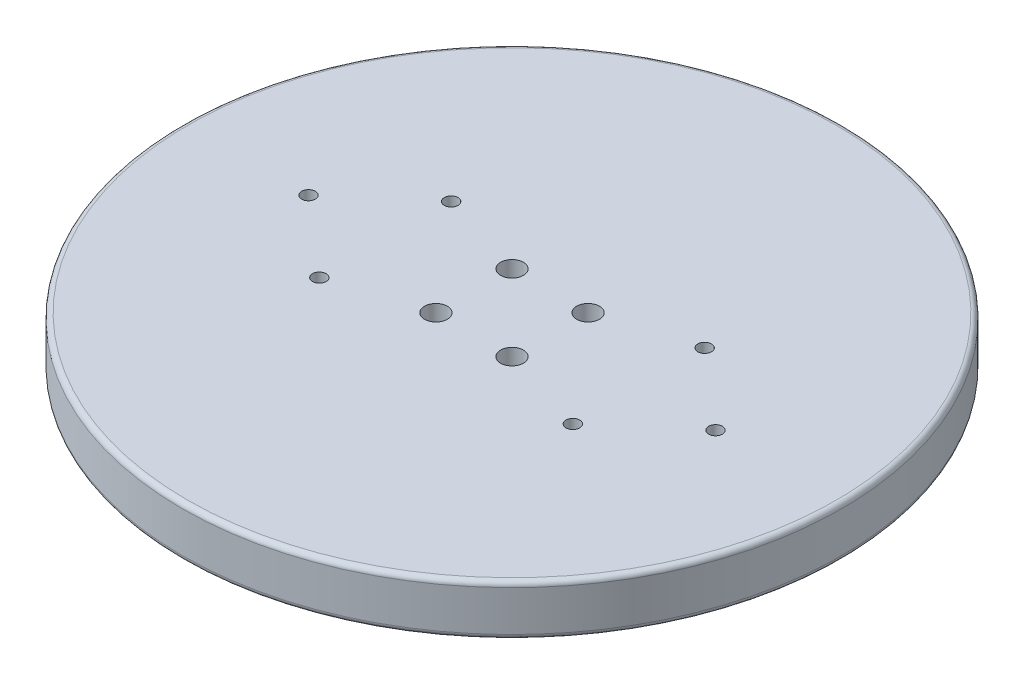
ISO-10303-21;
HEADER;
FILE_DESCRIPTION(('STEP AP214'),'2;1');
FILE_NAME('part.step','',(''),(''),'','','');
FILE_SCHEMA(('AUTOMOTIVE_DESIGN { 1 0 10303 214 1 1 1 1 }'));
ENDSEC;
DATA;
#1=APPLICATION_CONTEXT('core data for automotive mechanical design processes');
#2=APPLICATION_PROTOCOL_DEFINITION('international standard','automotive_design',2000,#1);
#3=PRODUCT_CONTEXT('',#1,'mechanical');
#4=PRODUCT('Part','Part','',(#3));
#5=PRODUCT_RELATED_PRODUCT_CATEGORY('part','',(#4));
#6=PRODUCT_DEFINITION_FORMATION('','',#4);
#7=PRODUCT_DEFINITION_CONTEXT('part definition',#1,'design');
#8=PRODUCT_DEFINITION('design','',#6,#7);
#9=PRODUCT_DEFINITION_SHAPE('','',#8);
#10=(LENGTH_UNIT() NAMED_UNIT(*) SI_UNIT(.MILLI.,.METRE.));
#11=(NAMED_UNIT(*) PLANE_ANGLE_UNIT() SI_UNIT($,.RADIAN.));
#12=(NAMED_UNIT(*) SI_UNIT($,.STERADIAN.) SOLID_ANGLE_UNIT());
#13=UNCERTAINTY_MEASURE_WITH_UNIT(LENGTH_MEASURE(1.E-05),#10,'distance_accuracy_value','');
#14=(GEOMETRIC_REPRESENTATION_CONTEXT(3) GLOBAL_UNCERTAINTY_ASSIGNED_CONTEXT((#13)) GLOBAL_UNIT_ASSIGNED_CONTEXT((#10,
#11,#12)) REPRESENTATION_CONTEXT('',''));
#15=CARTESIAN_POINT('',(0.,0.,0.));
#16=DIRECTION('',(0.,0.,1.));
#17=DIRECTION('',(1.,0.,0.));
#18=AXIS2_PLACEMENT_3D('',#15,#16,#17);
#19=CARTESIAN_POINT('',(0.,10.,0.));
#20=DIRECTION('',(0.,1.,0.));
#21=DIRECTION('',(0.,0.,1.));
#22=AXIS2_PLACEMENT_3D('',#19,#20,#21);
#23=PLANE('',#22);
#24=CARTESIAN_POINT('',(0.,10.,0.));
#25=DIRECTION('',(0.,1.,0.));
#26=DIRECTION('',(0.,0.,1.));
#27=AXIS2_PLACEMENT_3D('',#24,#25,#26);
#28=CIRCLE('',#27,64.);
#29=CARTESIAN_POINT('',(0.,10.,64.));
#30=VERTEX_POINT('',#29);
#31=EDGE_CURVE('E10',#30,#30,#28,.T.);
#32=ORIENTED_EDGE('',*,*,#31,.T.);
#33=EDGE_LOOP('',(#32));
#34=FACE_BOUND('',#33,.T.);
#35=CARTESIAN_POINT('',(25.,10.,-13.));
#36=DIRECTION('',(0.,-1.,0.));
#37=DIRECTION('',(0.,0.,-1.));
#38=AXIS2_PLACEMENT_3D('',#35,#36,#37);
#39=CIRCLE('',#38,1.35255);
#40=CARTESIAN_POINT('',(25.,10.,-14.35255));
#41=VERTEX_POINT('',#40);
#42=EDGE_CURVE('E53',#41,#41,#39,.T.);
#43=ORIENTED_EDGE('',*,*,#42,.T.);
#44=EDGE_LOOP('',(#43));
#45=FACE_BOUND('',#44,.T.);
#46=CARTESIAN_POINT('',(25.,10.,13.));
#47=DIRECTION('',(0.,-1.,0.));
#48=DIRECTION('',(0.,0.,-1.));
#49=AXIS2_PLACEMENT_3D('',#46,#47,#48);
#50=CIRCLE('',#49,1.35255);
#51=CARTESIAN_POINT('',(25.,10.,11.64745));
#52=VERTEX_POINT('',#51);
#53=EDGE_CURVE('E59',#52,#52,#50,.T.);
#54=ORIENTED_EDGE('',*,*,#53,.T.);
#55=EDGE_LOOP('',(#54));
#56=FACE_BOUND('',#55,.T.);
#57=CARTESIAN_POINT('',(-25.,10.,13.));
#58=DIRECTION('',(0.,-1.,0.));
#59=DIRECTION('',(0.,0.,-1.));
#60=AXIS2_PLACEMENT_3D('',#57,#58,#59);
#61=CIRCLE('',#60,1.35255);
#62=CARTESIAN_POINT('',(-25.,10.,11.64745));
#63=VERTEX_POINT('',#62);
#64=EDGE_CURVE('E65',#63,#63,#61,.T.);
#65=ORIENTED_EDGE('',*,*,#64,.T.);
#66=EDGE_LOOP('',(#65));
#67=FACE_BOUND('',#66,.T.);
#68=CARTESIAN_POINT('',(-25.,10.,-13.));
#69=DIRECTION('',(0.,-1.,0.));
#70=DIRECTION('',(0.,0.,-1.));
#71=AXIS2_PLACEMENT_3D('',#68,#69,#70);
#72=CIRCLE('',#71,1.35255);
#73=CARTESIAN_POINT('',(-25.,10.,-14.35255));
#74=VERTEX_POINT('',#73);
#75=EDGE_CURVE('E71',#74,#74,#72,.T.);
#76=ORIENTED_EDGE('',*,*,#75,.T.);
#77=EDGE_LOOP('',(#76));
#78=FACE_BOUND('',#77,.T.);
#79=CARTESIAN_POINT('',(40.14,10.,0.));
#80=DIRECTION('',(0.,-1.,0.));
#81=DIRECTION('',(0.,0.,-1.));
#82=AXIS2_PLACEMENT_3D('',#79,#80,#81);
#83=CIRCLE('',#82,1.35254999999999);
#84=CARTESIAN_POINT('',(40.14,10.,-1.35254999999999));
#85=VERTEX_POINT('',#84);
#86=EDGE_CURVE('E77',#85,#85,#83,.T.);
#87=ORIENTED_EDGE('',*,*,#86,.T.);
#88=EDGE_LOOP('',(#87));
#89=FACE_BOUND('',#88,.T.);
#90=CARTESIAN_POINT('',(-40.14,10.,0.));
#91=DIRECTION('',(0.,-1.,0.));
#92=DIRECTION('',(0.,0.,-1.));
#93=AXIS2_PLACEMENT_3D('',#90,#91,#92);
#94=CIRCLE('',#93,1.35254999999999);
#95=CARTESIAN_POINT('',(-40.14,10.,-1.35254999999999));
#96=VERTEX_POINT('',#95);
#97=EDGE_CURVE('E83',#96,#96,#94,.T.);
#98=ORIENTED_EDGE('',*,*,#97,.T.);
#99=EDGE_LOOP('',(#98));
#100=FACE_BOUND('',#99,.T.);
#101=CARTESIAN_POINT('',(7.5,10.,-7.5));
#102=DIRECTION('',(0.,-1.,0.));
#103=DIRECTION('',(0.,0.,-1.));
#104=AXIS2_PLACEMENT_3D('',#101,#102,#103);
#105=CIRCLE('',#104,2.2479);
#106=CARTESIAN_POINT('',(7.5,10.,-9.7479));
#107=VERTEX_POINT('',#106);
#108=EDGE_CURVE('E89',#107,#107,#105,.T.);
#109=ORIENTED_EDGE('',*,*,#108,.T.);
#110=EDGE_LOOP('',(#109));
#111=FACE_BOUND('',#110,.T.);
#112=CARTESIAN_POINT('',(-7.5,10.,-7.5));
#113=DIRECTION('',(0.,-1.,0.));
#114=DIRECTION('',(0.,0.,-1.));
#115=AXIS2_PLACEMENT_3D('',#112,#113,#114);
#116=CIRCLE('',#115,2.2479);
#117=CARTESIAN_POINT('',(-7.5,10.,-9.7479));
#118=VERTEX_POINT('',#117);
#119=EDGE_CURVE('E95',#118,#118,#116,.T.);
#120=ORIENTED_EDGE('',*,*,#119,.T.);
#121=EDGE_LOOP('',(#120));
#122=FACE_BOUND('',#121,.T.);
#123=CARTESIAN_POINT('',(7.5,10.,7.5));
#124=DIRECTION('',(0.,-1.,0.));
#125=DIRECTION('',(0.,0.,-1.));
#126=AXIS2_PLACEMENT_3D('',#123,#124,#125);
#127=CIRCLE('',#126,2.2479);
#128=CARTESIAN_POINT('',(7.5,10.,5.2521));
#129=VERTEX_POINT('',#128);
#130=EDGE_CURVE('E101',#129,#129,#127,.T.);
#131=ORIENTED_EDGE('',*,*,#130,.T.);
#132=EDGE_LOOP('',(#131));
#133=FACE_BOUND('',#132,.T.);
#134=CARTESIAN_POINT('',(-7.5,10.,7.5));
#135=DIRECTION('',(0.,-1.,0.));
#136=DIRECTION('',(0.,0.,-1.));
#137=AXIS2_PLACEMENT_3D('',#134,#135,#136);
#138=CIRCLE('',#137,2.2479);
#139=CARTESIAN_POINT('',(-7.5,10.,5.2521));
#140=VERTEX_POINT('',#139);
#141=EDGE_CURVE('E107',#140,#140,#138,.T.);
#142=ORIENTED_EDGE('',*,*,#141,.T.);
#143=EDGE_LOOP('',(#142));
#144=FACE_BOUND('',#143,.T.);
#145=ADVANCED_FACE('F33',(#34,#45,#56,#67,#78,#89,#100,#111,#122,#133,#144),#23,.T.);
#146=CARTESIAN_POINT('',(0.,0.,0.));
#147=DIRECTION('',(0.,1.,0.));
#148=DIRECTION('',(0.,0.,1.));
#149=AXIS2_PLACEMENT_3D('',#146,#147,#148);
#150=PLANE('',#149);
#151=CARTESIAN_POINT('',(-7.5,0.,7.5));
#152=DIRECTION('',(0.,-1.,0.));
#153=DIRECTION('',(0.,0.,-1.));
#154=AXIS2_PLACEMENT_3D('',#151,#152,#153);
#155=CIRCLE('',#154,2.2479);
#156=CARTESIAN_POINT('',(-7.5,0.,5.2521));
#157=VERTEX_POINT('',#156);
#158=EDGE_CURVE('E110',#157,#157,#155,.T.);
#159=ORIENTED_EDGE('',*,*,#158,.F.);
#160=EDGE_LOOP('',(#159));
#161=FACE_BOUND('',#160,.T.);
#162=CARTESIAN_POINT('',(-7.5,0.,-7.5));
#163=DIRECTION('',(0.,-1.,0.));
#164=DIRECTION('',(0.,0.,-1.));
#165=AXIS2_PLACEMENT_3D('',#162,#163,#164);
#166=CIRCLE('',#165,2.2479);
#167=CARTESIAN_POINT('',(-7.5,0.,-9.7479));
#168=VERTEX_POINT('',#167);
#169=EDGE_CURVE('E98',#168,#168,#166,.T.);
#170=ORIENTED_EDGE('',*,*,#169,.F.);
#171=EDGE_LOOP('',(#170));
#172=FACE_BOUND('',#171,.T.);
#173=CARTESIAN_POINT('',(7.5,0.,-7.5));
#174=DIRECTION('',(0.,-1.,0.));
#175=DIRECTION('',(0.,0.,-1.));
#176=AXIS2_PLACEMENT_3D('',#173,#174,#175);
#177=CIRCLE('',#176,2.2479);
#178=CARTESIAN_POINT('',(7.5,0.,-9.7479));
#179=VERTEX_POINT('',#178);
#180=EDGE_CURVE('E92',#179,#179,#177,.T.);
#181=ORIENTED_EDGE('',*,*,#180,.F.);
#182=EDGE_LOOP('',(#181));
#183=FACE_BOUND('',#182,.T.);
#184=CARTESIAN_POINT('',(-40.14,0.,0.));
#185=DIRECTION('',(0.,-1.,0.));
#186=DIRECTION('',(0.,0.,-1.));
#187=AXIS2_PLACEMENT_3D('',#184,#185,#186);
#188=CIRCLE('',#187,1.35255);
#189=CARTESIAN_POINT('',(-40.14,0.,-1.35255));
#190=VERTEX_POINT('',#189);
#191=EDGE_CURVE('E86',#190,#190,#188,.T.);
#192=ORIENTED_EDGE('',*,*,#191,.F.);
#193=EDGE_LOOP('',(#192));
#194=FACE_BOUND('',#193,.T.);
#195=CARTESIAN_POINT('',(40.14,0.,0.));
#196=DIRECTION('',(0.,-1.,0.));
#197=DIRECTION('',(0.,0.,-1.));
#198=AXIS2_PLACEMENT_3D('',#195,#196,#197);
#199=CIRCLE('',#198,1.35255);
#200=CARTESIAN_POINT('',(40.14,0.,-1.35255));
#201=VERTEX_POINT('',#200);
#202=EDGE_CURVE('E80',#201,#201,#199,.T.);
#203=ORIENTED_EDGE('',*,*,#202,.F.);
#204=EDGE_LOOP('',(#203));
#205=FACE_BOUND('',#204,.T.);
#206=CARTESIAN_POINT('',(-25.,0.,-13.));
#207=DIRECTION('',(0.,-1.,0.));
#208=DIRECTION('',(0.,0.,-1.));
#209=AXIS2_PLACEMENT_3D('',#206,#207,#208);
#210=CIRCLE('',#209,1.35255);
#211=CARTESIAN_POINT('',(-25.,0.,-14.35255));
#212=VERTEX_POINT('',#211);
#213=EDGE_CURVE('E74',#212,#212,#210,.T.);
#214=ORIENTED_EDGE('',*,*,#213,.F.);
#215=EDGE_LOOP('',(#214));
#216=FACE_BOUND('',#215,.T.);
#217=CARTESIAN_POINT('',(-25.,0.,13.));
#218=DIRECTION('',(0.,-1.,0.));
#219=DIRECTION('',(0.,0.,-1.));
#220=AXIS2_PLACEMENT_3D('',#217,#218,#219);
#221=CIRCLE('',#220,1.35255);
#222=CARTESIAN_POINT('',(-25.,0.,11.64745));
#223=VERTEX_POINT('',#222);
#224=EDGE_CURVE('E68',#223,#223,#221,.T.);
#225=ORIENTED_EDGE('',*,*,#224,.F.);
#226=EDGE_LOOP('',(#225));
#227=FACE_BOUND('',#226,.T.);
#228=CARTESIAN_POINT('',(25.,0.,13.));
#229=DIRECTION('',(0.,-1.,0.));
#230=DIRECTION('',(0.,0.,-1.));
#231=AXIS2_PLACEMENT_3D('',#228,#229,#230);
#232=CIRCLE('',#231,1.35255);
#233=CARTESIAN_POINT('',(25.,0.,11.64745));
#234=VERTEX_POINT('',#233);
#235=EDGE_CURVE('E62',#234,#234,#232,.T.);
#236=ORIENTED_EDGE('',*,*,#235,.F.);
#237=EDGE_LOOP('',(#236));
#238=FACE_BOUND('',#237,.T.);
#239=CARTESIAN_POINT('',(25.,0.,-13.));
#240=DIRECTION('',(0.,-1.,0.));
#241=DIRECTION('',(0.,0.,-1.));
#242=AXIS2_PLACEMENT_3D('',#239,#240,#241);
#243=CIRCLE('',#242,1.35255);
#244=CARTESIAN_POINT('',(25.,0.,-14.35255));
#245=VERTEX_POINT('',#244);
#246=EDGE_CURVE('E56',#245,#245,#243,.T.);
#247=ORIENTED_EDGE('',*,*,#246,.F.);
#248=EDGE_LOOP('',(#247));
#249=FACE_BOUND('',#248,.T.);
#250=CARTESIAN_POINT('',(0.,0.,0.));
#251=DIRECTION('',(0.,1.,0.));
#252=DIRECTION('',(0.,0.,1.));
#253=AXIS2_PLACEMENT_3D('',#250,#251,#252);
#254=CIRCLE('',#253,64.);
#255=CARTESIAN_POINT('',(0.,0.,64.));
#256=VERTEX_POINT('',#255);
#257=EDGE_CURVE('E40',#256,#256,#254,.F.);
#258=ORIENTED_EDGE('',*,*,#257,.T.);
#259=EDGE_LOOP('',(#258));
#260=FACE_BOUND('',#259,.T.);
#261=CARTESIAN_POINT('',(7.5,0.,7.5));
#262=DIRECTION('',(0.,-1.,0.));
#263=DIRECTION('',(0.,0.,-1.));
#264=AXIS2_PLACEMENT_3D('',#261,#262,#263);
#265=CIRCLE('',#264,2.2479);
#266=CARTESIAN_POINT('',(7.5,0.,5.2521));
#267=VERTEX_POINT('',#266);
#268=EDGE_CURVE('E104',#267,#267,#265,.T.);
#269=ORIENTED_EDGE('',*,*,#268,.F.);
#270=EDGE_LOOP('',(#269));
#271=FACE_BOUND('',#270,.T.);
#272=ADVANCED_FACE('F116',(#161,#172,#183,#194,#205,#216,#227,#238,#249,#260,#271),#150,.F.);
#273=CARTESIAN_POINT('',(0.,10.,0.));
#274=DIRECTION('',(0.,-1.,0.));
#275=DIRECTION('',(0.,0.,-1.));
#276=AXIS2_PLACEMENT_3D('',#273,#274,#275);
#277=CYLINDRICAL_SURFACE('',#276,65.);
#278=CARTESIAN_POINT('',(0.,0.999999999999999,0.));
#279=DIRECTION('',(0.,1.,0.));
#280=DIRECTION('',(0.,0.,1.));
#281=AXIS2_PLACEMENT_3D('',#278,#279,#280);
#282=CIRCLE('',#281,65.);
#283=CARTESIAN_POINT('',(0.,0.999999999999999,65.));
#284=VERTEX_POINT('',#283);
#285=EDGE_CURVE('E44',#284,#284,#282,.T.);
#286=ORIENTED_EDGE('',*,*,#285,.T.);
#287=EDGE_LOOP('',(#286));
#288=FACE_BOUND('',#287,.T.);
#289=CARTESIAN_POINT('',(0.,9.,0.));
#290=DIRECTION('',(0.,1.,0.));
#291=DIRECTION('',(0.,0.,1.));
#292=AXIS2_PLACEMENT_3D('',#289,#290,#291);
#293=CIRCLE('',#292,65.);
#294=CARTESIAN_POINT('',(0.,9.,65.));
#295=VERTEX_POINT('',#294);
#296=EDGE_CURVE('E48',#295,#295,#293,.F.);
#297=ORIENTED_EDGE('',*,*,#296,.T.);
#298=EDGE_LOOP('',(#297));
#299=FACE_BOUND('',#298,.T.);
#300=ADVANCED_FACE('F119',(#288,#299),#277,.T.);
#301=CARTESIAN_POINT('',(0.,0.999999999999999,0.));
#302=DIRECTION('',(0.,1.,0.));
#303=DIRECTION('',(0.,0.,1.));
#304=AXIS2_PLACEMENT_3D('',#301,#302,#303);
#305=TOROIDAL_SURFACE('',#304,64.,1.);
#306=ORIENTED_EDGE('',*,*,#257,.F.);
#307=EDGE_LOOP('',(#306));
#308=FACE_BOUND('',#307,.T.);
#309=ORIENTED_EDGE('',*,*,#285,.F.);
#310=EDGE_LOOP('',(#309));
#311=FACE_BOUND('',#310,.T.);
#312=ADVANCED_FACE('F164',(#308,#311),#305,.T.);
#313=CARTESIAN_POINT('',(0.,9.,0.));
#314=DIRECTION('',(0.,1.,0.));
#315=DIRECTION('',(0.,0.,1.));
#316=AXIS2_PLACEMENT_3D('',#313,#314,#315);
#317=TOROIDAL_SURFACE('',#316,64.,1.);
#318=ORIENTED_EDGE('',*,*,#296,.F.);
#319=EDGE_LOOP('',(#318));
#320=FACE_BOUND('',#319,.T.);
#321=ORIENTED_EDGE('',*,*,#31,.F.);
#322=EDGE_LOOP('',(#321));
#323=FACE_BOUND('',#322,.T.);
#324=ADVANCED_FACE('F35',(#320,#323),#317,.T.);
#325=CARTESIAN_POINT('',(25.,0.,-13.));
#326=DIRECTION('',(0.,-1.,0.));
#327=DIRECTION('',(0.,0.,-1.));
#328=AXIS2_PLACEMENT_3D('',#325,#326,#327);
#329=CYLINDRICAL_SURFACE('',#328,1.35255);
#330=ORIENTED_EDGE('',*,*,#42,.F.);
#331=EDGE_LOOP('',(#330));
#332=FACE_BOUND('',#331,.T.);
#333=ORIENTED_EDGE('',*,*,#246,.T.);
#334=EDGE_LOOP('',(#333));
#335=FACE_BOUND('',#334,.T.);
#336=ADVANCED_FACE('F160',(#332,#335),#329,.F.);
#337=CARTESIAN_POINT('',(25.,0.,13.));
#338=DIRECTION('',(0.,-1.,0.));
#339=DIRECTION('',(0.,0.,-1.));
#340=AXIS2_PLACEMENT_3D('',#337,#338,#339);
#341=CYLINDRICAL_SURFACE('',#340,1.35255);
#342=ORIENTED_EDGE('',*,*,#53,.F.);
#343=EDGE_LOOP('',(#342));
#344=FACE_BOUND('',#343,.T.);
#345=ORIENTED_EDGE('',*,*,#235,.T.);
#346=EDGE_LOOP('',(#345));
#347=FACE_BOUND('',#346,.T.);
#348=ADVANCED_FACE('F180',(#344,#347),#341,.F.);
#349=CARTESIAN_POINT('',(-25.,0.,13.));
#350=DIRECTION('',(0.,-1.,0.));
#351=DIRECTION('',(0.,0.,-1.));
#352=AXIS2_PLACEMENT_3D('',#349,#350,#351);
#353=CYLINDRICAL_SURFACE('',#352,1.35255);
#354=ORIENTED_EDGE('',*,*,#64,.F.);
#355=EDGE_LOOP('',(#354));
#356=FACE_BOUND('',#355,.T.);
#357=ORIENTED_EDGE('',*,*,#224,.T.);
#358=EDGE_LOOP('',(#357));
#359=FACE_BOUND('',#358,.T.);
#360=ADVANCED_FACE('F185',(#356,#359),#353,.F.);
#361=CARTESIAN_POINT('',(-25.,0.,-13.));
#362=DIRECTION('',(0.,-1.,0.));
#363=DIRECTION('',(0.,0.,-1.));
#364=AXIS2_PLACEMENT_3D('',#361,#362,#363);
#365=CYLINDRICAL_SURFACE('',#364,1.35255);
#366=ORIENTED_EDGE('',*,*,#75,.F.);
#367=EDGE_LOOP('',(#366));
#368=FACE_BOUND('',#367,.T.);
#369=ORIENTED_EDGE('',*,*,#213,.T.);
#370=EDGE_LOOP('',(#369));
#371=FACE_BOUND('',#370,.T.);
#372=ADVANCED_FACE('F221',(#368,#371),#365,.F.);
#373=CARTESIAN_POINT('',(40.14,0.,0.));
#374=DIRECTION('',(0.,-1.,0.));
#375=DIRECTION('',(0.,0.,-1.));
#376=AXIS2_PLACEMENT_3D('',#373,#374,#375);
#377=CYLINDRICAL_SURFACE('',#376,1.35255);
#378=ORIENTED_EDGE('',*,*,#86,.F.);
#379=EDGE_LOOP('',(#378));
#380=FACE_BOUND('',#379,.T.);
#381=ORIENTED_EDGE('',*,*,#202,.T.);
#382=EDGE_LOOP('',(#381));
#383=FACE_BOUND('',#382,.T.);
#384=ADVANCED_FACE('F215',(#380,#383),#377,.F.);
#385=CARTESIAN_POINT('',(-40.14,0.,0.));
#386=DIRECTION('',(0.,-1.,0.));
#387=DIRECTION('',(0.,0.,-1.));
#388=AXIS2_PLACEMENT_3D('',#385,#386,#387);
#389=CYLINDRICAL_SURFACE('',#388,1.35255);
#390=ORIENTED_EDGE('',*,*,#97,.F.);
#391=EDGE_LOOP('',(#390));
#392=FACE_BOUND('',#391,.T.);
#393=ORIENTED_EDGE('',*,*,#191,.T.);
#394=EDGE_LOOP('',(#393));
#395=FACE_BOUND('',#394,.T.);
#396=ADVANCED_FACE('F210',(#392,#395),#389,.F.);
#397=CARTESIAN_POINT('',(7.5,0.,-7.5));
#398=DIRECTION('',(0.,-1.,0.));
#399=DIRECTION('',(0.,0.,-1.));
#400=AXIS2_PLACEMENT_3D('',#397,#398,#399);
#401=CYLINDRICAL_SURFACE('',#400,2.2479);
#402=ORIENTED_EDGE('',*,*,#108,.F.);
#403=EDGE_LOOP('',(#402));
#404=FACE_BOUND('',#403,.T.);
#405=ORIENTED_EDGE('',*,*,#180,.T.);
#406=EDGE_LOOP('',(#405));
#407=FACE_BOUND('',#406,.T.);
#408=ADVANCED_FACE('F150',(#404,#407),#401,.F.);
#409=CARTESIAN_POINT('',(-7.5,0.,-7.5));
#410=DIRECTION('',(0.,-1.,0.));
#411=DIRECTION('',(0.,0.,-1.));
#412=AXIS2_PLACEMENT_3D('',#409,#410,#411);
#413=CYLINDRICAL_SURFACE('',#412,2.2479);
#414=ORIENTED_EDGE('',*,*,#119,.F.);
#415=EDGE_LOOP('',(#414));
#416=FACE_BOUND('',#415,.T.);
#417=ORIENTED_EDGE('',*,*,#169,.T.);
#418=EDGE_LOOP('',(#417));
#419=FACE_BOUND('',#418,.T.);
#420=ADVANCED_FACE('F141',(#416,#419),#413,.F.);
#421=CARTESIAN_POINT('',(7.5,0.,7.5));
#422=DIRECTION('',(0.,-1.,0.));
#423=DIRECTION('',(0.,0.,-1.));
#424=AXIS2_PLACEMENT_3D('',#421,#422,#423);
#425=CYLINDRICAL_SURFACE('',#424,2.2479);
#426=ORIENTED_EDGE('',*,*,#130,.F.);
#427=EDGE_LOOP('',(#426));
#428=FACE_BOUND('',#427,.T.);
#429=ORIENTED_EDGE('',*,*,#268,.T.);
#430=EDGE_LOOP('',(#429));
#431=FACE_BOUND('',#430,.T.);
#432=ADVANCED_FACE('F139',(#428,#431),#425,.F.);
#433=CARTESIAN_POINT('',(-7.5,0.,7.5));
#434=DIRECTION('',(0.,-1.,0.));
#435=DIRECTION('',(0.,0.,-1.));
#436=AXIS2_PLACEMENT_3D('',#433,#434,#435);
#437=CYLINDRICAL_SURFACE('',#436,2.2479);
#438=ORIENTED_EDGE('',*,*,#141,.F.);
#439=EDGE_LOOP('',(#438));
#440=FACE_BOUND('',#439,.T.);
#441=ORIENTED_EDGE('',*,*,#158,.T.);
#442=EDGE_LOOP('',(#441));
#443=FACE_BOUND('',#442,.T.);
#444=ADVANCED_FACE('F114',(#440,#443),#437,.F.);
#445=CLOSED_SHELL('',(#145,#272,#300,#312,#324,#336,#348,#360,#372,#384,#396,#408,#420,#432,#444));
#446=MANIFOLD_SOLID_BREP('B2',#445);
#447=ADVANCED_BREP_SHAPE_REPRESENTATION('',(#18,#446),#14);
#448=SHAPE_DEFINITION_REPRESENTATION(#9,#447);
ENDSEC;
END-ISO-10303-21;
